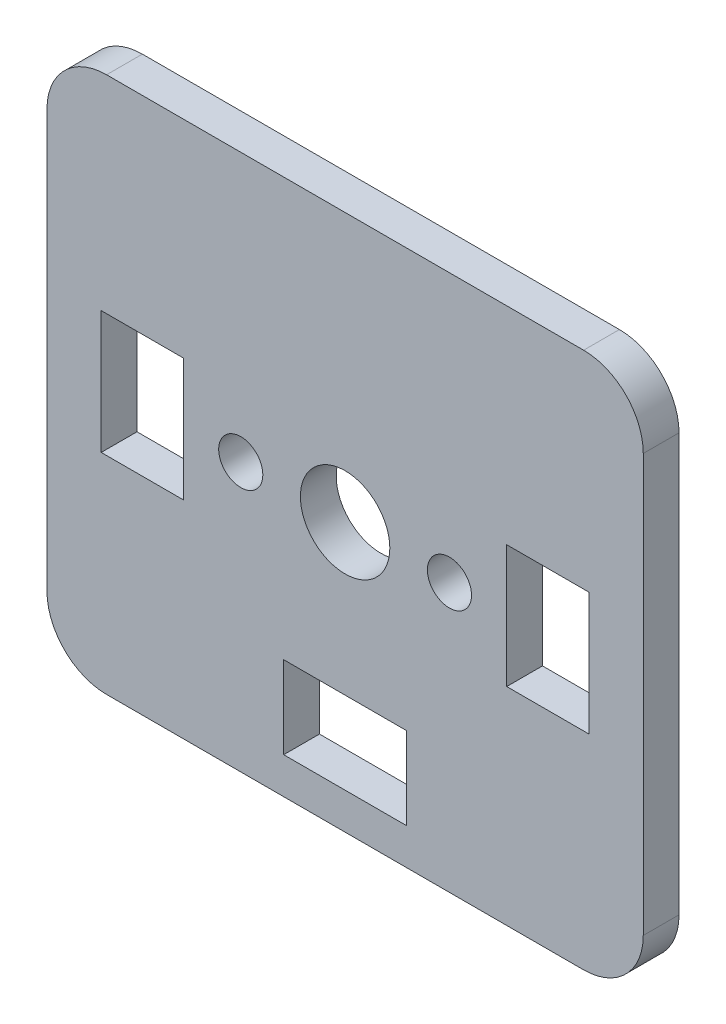
ISO-10303-21;
HEADER;
FILE_DESCRIPTION(('STEP AP214'),'2;1');
FILE_NAME('part.step','',(''),(''),'','','');
FILE_SCHEMA(('AUTOMOTIVE_DESIGN { 1 0 10303 214 1 1 1 1 }'));
ENDSEC;
DATA;
#1=APPLICATION_CONTEXT('core data for automotive mechanical design processes');
#2=APPLICATION_PROTOCOL_DEFINITION('international standard','automotive_design',2000,#1);
#3=PRODUCT_CONTEXT('',#1,'mechanical');
#4=PRODUCT('Part','Part','',(#3));
#5=PRODUCT_RELATED_PRODUCT_CATEGORY('part','',(#4));
#6=PRODUCT_DEFINITION_FORMATION('','',#4);
#7=PRODUCT_DEFINITION_CONTEXT('part definition',#1,'design');
#8=PRODUCT_DEFINITION('design','',#6,#7);
#9=PRODUCT_DEFINITION_SHAPE('','',#8);
#10=(LENGTH_UNIT() NAMED_UNIT(*) SI_UNIT(.MILLI.,.METRE.));
#11=(NAMED_UNIT(*) PLANE_ANGLE_UNIT() SI_UNIT($,.RADIAN.));
#12=(NAMED_UNIT(*) SI_UNIT($,.STERADIAN.) SOLID_ANGLE_UNIT());
#13=UNCERTAINTY_MEASURE_WITH_UNIT(LENGTH_MEASURE(1.E-05),#10,'distance_accuracy_value','');
#14=(GEOMETRIC_REPRESENTATION_CONTEXT(3) GLOBAL_UNCERTAINTY_ASSIGNED_CONTEXT((#13)) GLOBAL_UNIT_ASSIGNED_CONTEXT((#10,
#11,#12)) REPRESENTATION_CONTEXT('',''));
#15=CARTESIAN_POINT('',(0.,0.,0.));
#16=DIRECTION('',(0.,0.,1.));
#17=DIRECTION('',(1.,0.,0.));
#18=AXIS2_PLACEMENT_3D('',#15,#16,#17);
#19=CARTESIAN_POINT('',(0.,0.,3.));
#20=DIRECTION('',(0.,0.,-1.));
#21=DIRECTION('',(-1.,0.,0.));
#22=AXIS2_PLACEMENT_3D('',#19,#20,#21);
#23=PLANE('',#22);
#24=DIRECTION('',(0.,1.,0.));
#25=VECTOR('',#24,1.);
#26=CARTESIAN_POINT('',(20.45,5.15000000000001,3.));
#27=LINE('',#26,#25);
#28=CARTESIAN_POINT('',(20.45,-5.14999999999999,3.));
#29=VERTEX_POINT('',#28);
#30=CARTESIAN_POINT('',(20.45,5.15000000000001,3.));
#31=VERTEX_POINT('',#30);
#32=EDGE_CURVE('E214',#29,#31,#27,.T.);
#33=ORIENTED_EDGE('',*,*,#32,.F.);
#34=DIRECTION('',(1.,0.,0.));
#35=VECTOR('',#34,1.);
#36=CARTESIAN_POINT('',(20.45,-5.14999999999999,3.));
#37=LINE('',#36,#35);
#38=CARTESIAN_POINT('',(13.55,-5.15,3.));
#39=VERTEX_POINT('',#38);
#40=EDGE_CURVE('E222',#39,#29,#37,.T.);
#41=ORIENTED_EDGE('',*,*,#40,.F.);
#42=DIRECTION('',(0.,-1.,0.));
#43=VECTOR('',#42,1.);
#44=CARTESIAN_POINT('',(13.55,5.15,3.));
#45=LINE('',#44,#43);
#46=CARTESIAN_POINT('',(13.55,5.15,3.));
#47=VERTEX_POINT('',#46);
#48=EDGE_CURVE('E219',#47,#39,#45,.T.);
#49=ORIENTED_EDGE('',*,*,#48,.F.);
#50=DIRECTION('',(-1.,0.,0.));
#51=VECTOR('',#50,1.);
#52=CARTESIAN_POINT('',(20.45,5.15000000000001,3.));
#53=LINE('',#52,#51);
#54=EDGE_CURVE('E216',#31,#47,#53,.T.);
#55=ORIENTED_EDGE('',*,*,#54,.F.);
#56=EDGE_LOOP('',(#33,#41,#49,#55));
#57=FACE_BOUND('',#56,.T.);
#58=CARTESIAN_POINT('',(-8.75,0.,3.));
#59=DIRECTION('',(0.,0.,1.));
#60=DIRECTION('',(1.,0.,0.));
#61=AXIS2_PLACEMENT_3D('',#58,#59,#60);
#62=CIRCLE('',#61,1.85);
#63=CARTESIAN_POINT('',(-6.9,0.,3.));
#64=VERTEX_POINT('',#63);
#65=EDGE_CURVE('E276',#64,#64,#62,.T.);
#66=ORIENTED_EDGE('',*,*,#65,.F.);
#67=EDGE_LOOP('',(#66));
#68=FACE_BOUND('',#67,.T.);
#69=CARTESIAN_POINT('',(8.75,0.,3.));
#70=DIRECTION('',(0.,0.,1.));
#71=DIRECTION('',(1.,0.,0.));
#72=AXIS2_PLACEMENT_3D('',#69,#70,#71);
#73=CIRCLE('',#72,1.85);
#74=CARTESIAN_POINT('',(10.6,0.,3.));
#75=VERTEX_POINT('',#74);
#76=EDGE_CURVE('E282',#75,#75,#73,.T.);
#77=ORIENTED_EDGE('',*,*,#76,.F.);
#78=EDGE_LOOP('',(#77));
#79=FACE_BOUND('',#78,.T.);
#80=CARTESIAN_POINT('',(0.,0.,3.));
#81=DIRECTION('',(0.,0.,1.));
#82=DIRECTION('',(1.,0.,0.));
#83=AXIS2_PLACEMENT_3D('',#80,#81,#82);
#84=CIRCLE('',#83,3.75);
#85=CARTESIAN_POINT('',(3.75000000000001,0.,3.));
#86=VERTEX_POINT('',#85);
#87=EDGE_CURVE('E288',#86,#86,#84,.T.);
#88=ORIENTED_EDGE('',*,*,#87,.F.);
#89=EDGE_LOOP('',(#88));
#90=FACE_BOUND('',#89,.T.);
#91=DIRECTION('',(-1.,0.,0.));
#92=VECTOR('',#91,1.);
#93=CARTESIAN_POINT('',(-25.,22.5,3.));
#94=LINE('',#93,#92);
#95=CARTESIAN_POINT('',(20.,22.5,3.));
#96=VERTEX_POINT('',#95);
#97=CARTESIAN_POINT('',(-20.,22.5,3.));
#98=VERTEX_POINT('',#97);
#99=EDGE_CURVE('E297',#96,#98,#94,.T.);
#100=ORIENTED_EDGE('',*,*,#99,.T.);
#101=CARTESIAN_POINT('',(-20.,17.5,3.));
#102=DIRECTION('',(0.,0.,-1.));
#103=DIRECTION('',(-1.,0.,0.));
#104=AXIS2_PLACEMENT_3D('',#101,#102,#103);
#105=CIRCLE('',#104,5.);
#106=CARTESIAN_POINT('',(-25.,17.5,3.));
#107=VERTEX_POINT('',#106);
#108=EDGE_CURVE('E337',#98,#107,#105,.F.);
#109=ORIENTED_EDGE('',*,*,#108,.T.);
#110=DIRECTION('',(0.,-1.,0.));
#111=VECTOR('',#110,1.);
#112=CARTESIAN_POINT('',(-25.,-22.5,3.));
#113=LINE('',#112,#111);
#114=CARTESIAN_POINT('',(-25.,-17.5,3.));
#115=VERTEX_POINT('',#114);
#116=EDGE_CURVE('E301',#107,#115,#113,.T.);
#117=ORIENTED_EDGE('',*,*,#116,.T.);
#118=CARTESIAN_POINT('',(-20.,-17.5,3.));
#119=DIRECTION('',(0.,0.,-1.));
#120=DIRECTION('',(-1.,0.,0.));
#121=AXIS2_PLACEMENT_3D('',#118,#119,#120);
#122=CIRCLE('',#121,5.);
#123=CARTESIAN_POINT('',(-20.,-22.5,3.));
#124=VERTEX_POINT('',#123);
#125=EDGE_CURVE('E55',#115,#124,#122,.F.);
#126=ORIENTED_EDGE('',*,*,#125,.T.);
#127=DIRECTION('',(1.,0.,0.));
#128=VECTOR('',#127,1.);
#129=CARTESIAN_POINT('',(-25.,-22.5,3.));
#130=LINE('',#129,#128);
#131=CARTESIAN_POINT('',(20.,-22.5,3.));
#132=VERTEX_POINT('',#131);
#133=EDGE_CURVE('E303',#124,#132,#130,.T.);
#134=ORIENTED_EDGE('',*,*,#133,.T.);
#135=CARTESIAN_POINT('',(20.,-17.5,3.));
#136=DIRECTION('',(0.,0.,-1.));
#137=DIRECTION('',(-1.,0.,0.));
#138=AXIS2_PLACEMENT_3D('',#135,#136,#137);
#139=CIRCLE('',#138,5.);
#140=CARTESIAN_POINT('',(25.,-17.5,3.));
#141=VERTEX_POINT('',#140);
#142=EDGE_CURVE('E334',#132,#141,#139,.F.);
#143=ORIENTED_EDGE('',*,*,#142,.T.);
#144=DIRECTION('',(0.,1.,0.));
#145=VECTOR('',#144,1.);
#146=CARTESIAN_POINT('',(25.,-22.5,3.));
#147=LINE('',#146,#145);
#148=CARTESIAN_POINT('',(25.,17.5,3.));
#149=VERTEX_POINT('',#148);
#150=EDGE_CURVE('E294',#141,#149,#147,.T.);
#151=ORIENTED_EDGE('',*,*,#150,.T.);
#152=CARTESIAN_POINT('',(20.,17.5,3.));
#153=DIRECTION('',(0.,0.,-1.));
#154=DIRECTION('',(-1.,0.,0.));
#155=AXIS2_PLACEMENT_3D('',#152,#153,#154);
#156=CIRCLE('',#155,5.);
#157=EDGE_CURVE('E332',#149,#96,#156,.F.);
#158=ORIENTED_EDGE('',*,*,#157,.T.);
#159=EDGE_LOOP('',(#100,#109,#117,#126,#134,#143,#151,#158));
#160=FACE_BOUND('',#159,.T.);
#161=DIRECTION('',(0.,1.,0.));
#162=VECTOR('',#161,1.);
#163=CARTESIAN_POINT('',(-13.55,5.15,3.));
#164=LINE('',#163,#162);
#165=CARTESIAN_POINT('',(-13.55,-5.15,3.));
#166=VERTEX_POINT('',#165);
#167=CARTESIAN_POINT('',(-13.55,5.15,3.));
#168=VERTEX_POINT('',#167);
#169=EDGE_CURVE('E245',#166,#168,#164,.T.);
#170=ORIENTED_EDGE('',*,*,#169,.F.);
#171=DIRECTION('',(1.,0.,0.));
#172=VECTOR('',#171,1.);
#173=CARTESIAN_POINT('',(-20.45,-5.15,3.));
#174=LINE('',#173,#172);
#175=CARTESIAN_POINT('',(-20.45,-5.15,3.));
#176=VERTEX_POINT('',#175);
#177=EDGE_CURVE('E253',#176,#166,#174,.T.);
#178=ORIENTED_EDGE('',*,*,#177,.F.);
#179=DIRECTION('',(0.,-1.,0.));
#180=VECTOR('',#179,1.);
#181=CARTESIAN_POINT('',(-20.45,5.15,3.));
#182=LINE('',#181,#180);
#183=CARTESIAN_POINT('',(-20.45,5.15,3.));
#184=VERTEX_POINT('',#183);
#185=EDGE_CURVE('E250',#184,#176,#182,.T.);
#186=ORIENTED_EDGE('',*,*,#185,.F.);
#187=DIRECTION('',(-1.,0.,0.));
#188=VECTOR('',#187,1.);
#189=CARTESIAN_POINT('',(-20.45,5.15,3.));
#190=LINE('',#189,#188);
#191=EDGE_CURVE('E247',#168,#184,#190,.T.);
#192=ORIENTED_EDGE('',*,*,#191,.F.);
#193=EDGE_LOOP('',(#170,#178,#186,#192));
#194=FACE_BOUND('',#193,.T.);
#195=DIRECTION('',(0.,1.,0.));
#196=VECTOR('',#195,1.);
#197=CARTESIAN_POINT('',(5.15,-12.55,3.));
#198=LINE('',#197,#196);
#199=CARTESIAN_POINT('',(5.15,-19.45,3.));
#200=VERTEX_POINT('',#199);
#201=CARTESIAN_POINT('',(5.15,-12.55,3.));
#202=VERTEX_POINT('',#201);
#203=EDGE_CURVE('E173',#200,#202,#198,.T.);
#204=ORIENTED_EDGE('',*,*,#203,.F.);
#205=DIRECTION('',(1.,0.,0.));
#206=VECTOR('',#205,1.);
#207=CARTESIAN_POINT('',(-5.15,-19.45,3.));
#208=LINE('',#207,#206);
#209=CARTESIAN_POINT('',(-5.15,-19.45,3.));
#210=VERTEX_POINT('',#209);
#211=EDGE_CURVE('E198',#210,#200,#208,.T.);
#212=ORIENTED_EDGE('',*,*,#211,.F.);
#213=DIRECTION('',(0.,-1.,0.));
#214=VECTOR('',#213,1.);
#215=CARTESIAN_POINT('',(-5.15,-12.55,3.));
#216=LINE('',#215,#214);
#217=CARTESIAN_POINT('',(-5.15,-12.55,3.));
#218=VERTEX_POINT('',#217);
#219=EDGE_CURVE('E196',#218,#210,#216,.T.);
#220=ORIENTED_EDGE('',*,*,#219,.F.);
#221=DIRECTION('',(-1.,0.,0.));
#222=VECTOR('',#221,1.);
#223=CARTESIAN_POINT('',(-5.15,-12.55,3.));
#224=LINE('',#223,#222);
#225=EDGE_CURVE('E183',#202,#218,#224,.T.);
#226=ORIENTED_EDGE('',*,*,#225,.F.);
#227=EDGE_LOOP('',(#204,#212,#220,#226));
#228=FACE_BOUND('',#227,.T.);
#229=ADVANCED_FACE('F33',(#57,#68,#79,#90,#160,#194,#228),#23,.F.);
#230=CARTESIAN_POINT('',(0.,0.,0.));
#231=DIRECTION('',(0.,0.,-1.));
#232=DIRECTION('',(-1.,0.,0.));
#233=AXIS2_PLACEMENT_3D('',#230,#231,#232);
#234=PLANE('',#233);
#235=CARTESIAN_POINT('',(8.75,0.,0.));
#236=DIRECTION('',(0.,0.,1.));
#237=DIRECTION('',(1.,0.,0.));
#238=AXIS2_PLACEMENT_3D('',#235,#236,#237);
#239=CIRCLE('',#238,1.85);
#240=CARTESIAN_POINT('',(10.6,0.,0.));
#241=VERTEX_POINT('',#240);
#242=EDGE_CURVE('E279',#241,#241,#239,.T.);
#243=ORIENTED_EDGE('',*,*,#242,.T.);
#244=EDGE_LOOP('',(#243));
#245=FACE_BOUND('',#244,.T.);
#246=DIRECTION('',(0.,-1.,0.));
#247=VECTOR('',#246,1.);
#248=CARTESIAN_POINT('',(-25.,-22.5,0.));
#249=LINE('',#248,#247);
#250=CARTESIAN_POINT('',(-25.,17.5,0.));
#251=VERTEX_POINT('',#250);
#252=CARTESIAN_POINT('',(-25.,-17.5,0.));
#253=VERTEX_POINT('',#252);
#254=EDGE_CURVE('E311',#251,#253,#249,.T.);
#255=ORIENTED_EDGE('',*,*,#254,.F.);
#256=CARTESIAN_POINT('',(-20.,17.5,0.));
#257=DIRECTION('',(0.,0.,-1.));
#258=DIRECTION('',(-1.,0.,0.));
#259=AXIS2_PLACEMENT_3D('',#256,#257,#258);
#260=CIRCLE('',#259,5.);
#261=CARTESIAN_POINT('',(-20.,22.5,0.));
#262=VERTEX_POINT('',#261);
#263=EDGE_CURVE('E325',#251,#262,#260,.T.);
#264=ORIENTED_EDGE('',*,*,#263,.T.);
#265=DIRECTION('',(-1.,0.,0.));
#266=VECTOR('',#265,1.);
#267=CARTESIAN_POINT('',(-25.,22.5,0.));
#268=LINE('',#267,#266);
#269=CARTESIAN_POINT('',(20.,22.5,0.));
#270=VERTEX_POINT('',#269);
#271=EDGE_CURVE('E308',#270,#262,#268,.T.);
#272=ORIENTED_EDGE('',*,*,#271,.F.);
#273=CARTESIAN_POINT('',(20.,17.5,0.));
#274=DIRECTION('',(0.,0.,-1.));
#275=DIRECTION('',(-1.,0.,0.));
#276=AXIS2_PLACEMENT_3D('',#273,#274,#275);
#277=CIRCLE('',#276,5.);
#278=CARTESIAN_POINT('',(25.,17.5,0.));
#279=VERTEX_POINT('',#278);
#280=EDGE_CURVE('E319',#270,#279,#277,.T.);
#281=ORIENTED_EDGE('',*,*,#280,.T.);
#282=DIRECTION('',(0.,1.,0.));
#283=VECTOR('',#282,1.);
#284=CARTESIAN_POINT('',(25.,-22.5,0.));
#285=LINE('',#284,#283);
#286=CARTESIAN_POINT('',(25.,-17.5,0.));
#287=VERTEX_POINT('',#286);
#288=EDGE_CURVE('E291',#287,#279,#285,.T.);
#289=ORIENTED_EDGE('',*,*,#288,.F.);
#290=CARTESIAN_POINT('',(20.,-17.5,0.));
#291=DIRECTION('',(0.,0.,-1.));
#292=DIRECTION('',(-1.,0.,0.));
#293=AXIS2_PLACEMENT_3D('',#290,#291,#292);
#294=CIRCLE('',#293,5.);
#295=CARTESIAN_POINT('',(20.,-22.5,0.));
#296=VERTEX_POINT('',#295);
#297=EDGE_CURVE('E321',#287,#296,#294,.T.);
#298=ORIENTED_EDGE('',*,*,#297,.T.);
#299=DIRECTION('',(1.,0.,0.));
#300=VECTOR('',#299,1.);
#301=CARTESIAN_POINT('',(-25.,-22.5,0.));
#302=LINE('',#301,#300);
#303=CARTESIAN_POINT('',(-20.,-22.5,0.));
#304=VERTEX_POINT('',#303);
#305=EDGE_CURVE('E298',#304,#296,#302,.T.);
#306=ORIENTED_EDGE('',*,*,#305,.F.);
#307=CARTESIAN_POINT('',(-20.,-17.5,0.));
#308=DIRECTION('',(0.,0.,-1.));
#309=DIRECTION('',(-1.,0.,0.));
#310=AXIS2_PLACEMENT_3D('',#307,#308,#309);
#311=CIRCLE('',#310,5.);
#312=EDGE_CURVE('E323',#304,#253,#311,.T.);
#313=ORIENTED_EDGE('',*,*,#312,.T.);
#314=EDGE_LOOP('',(#255,#264,#272,#281,#289,#298,#306,#313));
#315=FACE_BOUND('',#314,.T.);
#316=CARTESIAN_POINT('',(0.,0.,0.));
#317=DIRECTION('',(0.,0.,1.));
#318=DIRECTION('',(1.,0.,0.));
#319=AXIS2_PLACEMENT_3D('',#316,#317,#318);
#320=CIRCLE('',#319,3.75);
#321=CARTESIAN_POINT('',(3.75000000000001,0.,0.));
#322=VERTEX_POINT('',#321);
#323=EDGE_CURVE('E285',#322,#322,#320,.T.);
#324=ORIENTED_EDGE('',*,*,#323,.T.);
#325=EDGE_LOOP('',(#324));
#326=FACE_BOUND('',#325,.T.);
#327=CARTESIAN_POINT('',(-8.75,0.,0.));
#328=DIRECTION('',(0.,0.,1.));
#329=DIRECTION('',(1.,0.,0.));
#330=AXIS2_PLACEMENT_3D('',#327,#328,#329);
#331=CIRCLE('',#330,1.85);
#332=CARTESIAN_POINT('',(-6.9,0.,0.));
#333=VERTEX_POINT('',#332);
#334=EDGE_CURVE('E275',#333,#333,#331,.T.);
#335=ORIENTED_EDGE('',*,*,#334,.T.);
#336=EDGE_LOOP('',(#335));
#337=FACE_BOUND('',#336,.T.);
#338=DIRECTION('',(1.,0.,0.));
#339=VECTOR('',#338,1.);
#340=CARTESIAN_POINT('',(-20.45,-5.15,0.));
#341=LINE('',#340,#339);
#342=CARTESIAN_POINT('',(-20.45,-5.15,0.));
#343=VERTEX_POINT('',#342);
#344=CARTESIAN_POINT('',(-13.55,-5.15,0.));
#345=VERTEX_POINT('',#344);
#346=EDGE_CURVE('E248',#343,#345,#341,.T.);
#347=ORIENTED_EDGE('',*,*,#346,.T.);
#348=DIRECTION('',(0.,1.,0.));
#349=VECTOR('',#348,1.);
#350=CARTESIAN_POINT('',(-13.55,5.15,0.));
#351=LINE('',#350,#349);
#352=CARTESIAN_POINT('',(-13.55,5.15,0.));
#353=VERTEX_POINT('',#352);
#354=EDGE_CURVE('E244',#345,#353,#351,.T.);
#355=ORIENTED_EDGE('',*,*,#354,.T.);
#356=DIRECTION('',(-1.,0.,0.));
#357=VECTOR('',#356,1.);
#358=CARTESIAN_POINT('',(-20.45,5.15,0.));
#359=LINE('',#358,#357);
#360=CARTESIAN_POINT('',(-20.45,5.15,0.));
#361=VERTEX_POINT('',#360);
#362=EDGE_CURVE('E258',#353,#361,#359,.T.);
#363=ORIENTED_EDGE('',*,*,#362,.T.);
#364=DIRECTION('',(0.,-1.,0.));
#365=VECTOR('',#364,1.);
#366=CARTESIAN_POINT('',(-20.45,5.15,0.));
#367=LINE('',#366,#365);
#368=EDGE_CURVE('E261',#361,#343,#367,.T.);
#369=ORIENTED_EDGE('',*,*,#368,.T.);
#370=EDGE_LOOP('',(#347,#355,#363,#369));
#371=FACE_BOUND('',#370,.T.);
#372=DIRECTION('',(1.,0.,0.));
#373=VECTOR('',#372,1.);
#374=CARTESIAN_POINT('',(20.45,-5.14999999999999,0.));
#375=LINE('',#374,#373);
#376=CARTESIAN_POINT('',(13.55,-5.15,0.));
#377=VERTEX_POINT('',#376);
#378=CARTESIAN_POINT('',(20.45,-5.14999999999999,0.));
#379=VERTEX_POINT('',#378);
#380=EDGE_CURVE('E217',#377,#379,#375,.T.);
#381=ORIENTED_EDGE('',*,*,#380,.T.);
#382=DIRECTION('',(0.,1.,0.));
#383=VECTOR('',#382,1.);
#384=CARTESIAN_POINT('',(20.45,5.15000000000001,0.));
#385=LINE('',#384,#383);
#386=CARTESIAN_POINT('',(20.45,5.15000000000001,0.));
#387=VERTEX_POINT('',#386);
#388=EDGE_CURVE('E191',#379,#387,#385,.T.);
#389=ORIENTED_EDGE('',*,*,#388,.T.);
#390=DIRECTION('',(-1.,0.,0.));
#391=VECTOR('',#390,1.);
#392=CARTESIAN_POINT('',(20.45,5.15000000000001,0.));
#393=LINE('',#392,#391);
#394=CARTESIAN_POINT('',(13.55,5.15,0.));
#395=VERTEX_POINT('',#394);
#396=EDGE_CURVE('E227',#387,#395,#393,.T.);
#397=ORIENTED_EDGE('',*,*,#396,.T.);
#398=DIRECTION('',(0.,-1.,0.));
#399=VECTOR('',#398,1.);
#400=CARTESIAN_POINT('',(13.55,5.15,0.));
#401=LINE('',#400,#399);
#402=EDGE_CURVE('E230',#395,#377,#401,.T.);
#403=ORIENTED_EDGE('',*,*,#402,.T.);
#404=EDGE_LOOP('',(#381,#389,#397,#403));
#405=FACE_BOUND('',#404,.T.);
#406=DIRECTION('',(1.,0.,0.));
#407=VECTOR('',#406,1.);
#408=CARTESIAN_POINT('',(-5.15,-19.45,0.));
#409=LINE('',#408,#407);
#410=CARTESIAN_POINT('',(-5.15,-19.45,0.));
#411=VERTEX_POINT('',#410);
#412=CARTESIAN_POINT('',(5.15,-19.45,0.));
#413=VERTEX_POINT('',#412);
#414=EDGE_CURVE('E184',#411,#413,#409,.T.);
#415=ORIENTED_EDGE('',*,*,#414,.T.);
#416=DIRECTION('',(0.,1.,0.));
#417=VECTOR('',#416,1.);
#418=CARTESIAN_POINT('',(5.15,-12.55,0.));
#419=LINE('',#418,#417);
#420=CARTESIAN_POINT('',(5.15,-12.55,0.));
#421=VERTEX_POINT('',#420);
#422=EDGE_CURVE('E202',#413,#421,#419,.T.);
#423=ORIENTED_EDGE('',*,*,#422,.T.);
#424=DIRECTION('',(-1.,0.,0.));
#425=VECTOR('',#424,1.);
#426=CARTESIAN_POINT('',(-5.15,-12.55,0.));
#427=LINE('',#426,#425);
#428=CARTESIAN_POINT('',(-5.15,-12.55,0.));
#429=VERTEX_POINT('',#428);
#430=EDGE_CURVE('E190',#421,#429,#427,.T.);
#431=ORIENTED_EDGE('',*,*,#430,.T.);
#432=DIRECTION('',(0.,-1.,0.));
#433=VECTOR('',#432,1.);
#434=CARTESIAN_POINT('',(-5.15,-12.55,0.));
#435=LINE('',#434,#433);
#436=EDGE_CURVE('E205',#429,#411,#435,.T.);
#437=ORIENTED_EDGE('',*,*,#436,.T.);
#438=EDGE_LOOP('',(#415,#423,#431,#437));
#439=FACE_BOUND('',#438,.T.);
#440=ADVANCED_FACE('F360',(#245,#315,#326,#337,#371,#405,#439),#234,.T.);
#441=CARTESIAN_POINT('',(25.,-22.5,3.));
#442=DIRECTION('',(-1.,0.,0.));
#443=DIRECTION('',(0.,0.,1.));
#444=AXIS2_PLACEMENT_3D('',#441,#442,#443);
#445=PLANE('',#444);
#446=ORIENTED_EDGE('',*,*,#150,.F.);
#447=DIRECTION('',(0.,0.,-1.));
#448=VECTOR('',#447,1.);
#449=CARTESIAN_POINT('',(25.,-17.5,3.));
#450=LINE('',#449,#448);
#451=EDGE_CURVE('E11',#141,#287,#450,.T.);
#452=ORIENTED_EDGE('',*,*,#451,.T.);
#453=ORIENTED_EDGE('',*,*,#288,.T.);
#454=DIRECTION('',(0.,0.,-1.));
#455=VECTOR('',#454,1.);
#456=CARTESIAN_POINT('',(25.,17.5,3.));
#457=LINE('',#456,#455);
#458=EDGE_CURVE('E41',#279,#149,#457,.F.);
#459=ORIENTED_EDGE('',*,*,#458,.T.);
#460=EDGE_LOOP('',(#446,#452,#453,#459));
#461=FACE_BOUND('',#460,.T.);
#462=ADVANCED_FACE('F345',(#461),#445,.F.);
#463=CARTESIAN_POINT('',(-25.,22.5,3.));
#464=DIRECTION('',(0.,-1.,0.));
#465=DIRECTION('',(0.,0.,-1.));
#466=AXIS2_PLACEMENT_3D('',#463,#464,#465);
#467=PLANE('',#466);
#468=ORIENTED_EDGE('',*,*,#271,.T.);
#469=DIRECTION('',(0.,0.,-1.));
#470=VECTOR('',#469,1.);
#471=CARTESIAN_POINT('',(-20.,22.5,3.));
#472=LINE('',#471,#470);
#473=EDGE_CURVE('E330',#262,#98,#472,.F.);
#474=ORIENTED_EDGE('',*,*,#473,.T.);
#475=ORIENTED_EDGE('',*,*,#99,.F.);
#476=DIRECTION('',(0.,0.,-1.));
#477=VECTOR('',#476,1.);
#478=CARTESIAN_POINT('',(20.,22.5,3.));
#479=LINE('',#478,#477);
#480=EDGE_CURVE('E327',#96,#270,#479,.T.);
#481=ORIENTED_EDGE('',*,*,#480,.T.);
#482=EDGE_LOOP('',(#468,#474,#475,#481));
#483=FACE_BOUND('',#482,.T.);
#484=ADVANCED_FACE('F356',(#483),#467,.F.);
#485=CARTESIAN_POINT('',(-25.,-22.5,3.));
#486=DIRECTION('',(1.,0.,0.));
#487=DIRECTION('',(0.,0.,-1.));
#488=AXIS2_PLACEMENT_3D('',#485,#486,#487);
#489=PLANE('',#488);
#490=ORIENTED_EDGE('',*,*,#116,.F.);
#491=DIRECTION('',(0.,0.,-1.));
#492=VECTOR('',#491,1.);
#493=CARTESIAN_POINT('',(-25.,17.5,3.));
#494=LINE('',#493,#492);
#495=EDGE_CURVE('E316',#107,#251,#494,.T.);
#496=ORIENTED_EDGE('',*,*,#495,.T.);
#497=ORIENTED_EDGE('',*,*,#254,.T.);
#498=DIRECTION('',(0.,0.,-1.));
#499=VECTOR('',#498,1.);
#500=CARTESIAN_POINT('',(-25.,-17.5,3.));
#501=LINE('',#500,#499);
#502=EDGE_CURVE('E305',#253,#115,#501,.F.);
#503=ORIENTED_EDGE('',*,*,#502,.T.);
#504=EDGE_LOOP('',(#490,#496,#497,#503));
#505=FACE_BOUND('',#504,.T.);
#506=ADVANCED_FACE('F368',(#505),#489,.F.);
#507=CARTESIAN_POINT('',(-25.,-22.5,3.));
#508=DIRECTION('',(0.,1.,0.));
#509=DIRECTION('',(0.,0.,1.));
#510=AXIS2_PLACEMENT_3D('',#507,#508,#509);
#511=PLANE('',#510);
#512=ORIENTED_EDGE('',*,*,#133,.F.);
#513=DIRECTION('',(0.,0.,-1.));
#514=VECTOR('',#513,1.);
#515=CARTESIAN_POINT('',(-20.,-22.5,3.));
#516=LINE('',#515,#514);
#517=EDGE_CURVE('E340',#124,#304,#516,.T.);
#518=ORIENTED_EDGE('',*,*,#517,.T.);
#519=ORIENTED_EDGE('',*,*,#305,.T.);
#520=DIRECTION('',(0.,0.,-1.));
#521=VECTOR('',#520,1.);
#522=CARTESIAN_POINT('',(20.,-22.5,3.));
#523=LINE('',#522,#521);
#524=EDGE_CURVE('E48',#296,#132,#523,.F.);
#525=ORIENTED_EDGE('',*,*,#524,.T.);
#526=EDGE_LOOP('',(#512,#518,#519,#525));
#527=FACE_BOUND('',#526,.T.);
#528=ADVANCED_FACE('F374',(#527),#511,.F.);
#529=CARTESIAN_POINT('',(0.,0.,3.));
#530=DIRECTION('',(0.,0.,-1.));
#531=DIRECTION('',(-1.,0.,0.));
#532=AXIS2_PLACEMENT_3D('',#529,#530,#531);
#533=CYLINDRICAL_SURFACE('',#532,3.75);
#534=ORIENTED_EDGE('',*,*,#87,.T.);
#535=EDGE_LOOP('',(#534));
#536=FACE_BOUND('',#535,.T.);
#537=ORIENTED_EDGE('',*,*,#323,.F.);
#538=EDGE_LOOP('',(#537));
#539=FACE_BOUND('',#538,.T.);
#540=ADVANCED_FACE('F394',(#536,#539),#533,.F.);
#541=CARTESIAN_POINT('',(8.75,0.,3.));
#542=DIRECTION('',(0.,0.,-1.));
#543=DIRECTION('',(-1.,0.,0.));
#544=AXIS2_PLACEMENT_3D('',#541,#542,#543);
#545=CYLINDRICAL_SURFACE('',#544,1.85);
#546=ORIENTED_EDGE('',*,*,#76,.T.);
#547=EDGE_LOOP('',(#546));
#548=FACE_BOUND('',#547,.T.);
#549=ORIENTED_EDGE('',*,*,#242,.F.);
#550=EDGE_LOOP('',(#549));
#551=FACE_BOUND('',#550,.T.);
#552=ADVANCED_FACE('F458',(#548,#551),#545,.F.);
#553=CARTESIAN_POINT('',(-8.75,0.,3.));
#554=DIRECTION('',(0.,0.,-1.));
#555=DIRECTION('',(-1.,0.,0.));
#556=AXIS2_PLACEMENT_3D('',#553,#554,#555);
#557=CYLINDRICAL_SURFACE('',#556,1.85);
#558=ORIENTED_EDGE('',*,*,#65,.T.);
#559=EDGE_LOOP('',(#558));
#560=FACE_BOUND('',#559,.T.);
#561=ORIENTED_EDGE('',*,*,#334,.F.);
#562=EDGE_LOOP('',(#561));
#563=FACE_BOUND('',#562,.T.);
#564=ADVANCED_FACE('F455',(#560,#563),#557,.F.);
#565=CARTESIAN_POINT('',(-13.55,5.15,3.));
#566=DIRECTION('',(-1.,0.,0.));
#567=DIRECTION('',(0.,0.,1.));
#568=AXIS2_PLACEMENT_3D('',#565,#566,#567);
#569=PLANE('',#568);
#570=ORIENTED_EDGE('',*,*,#354,.F.);
#571=DIRECTION('',(0.,0.,-1.));
#572=VECTOR('',#571,1.);
#573=CARTESIAN_POINT('',(-13.55,-5.15,3.));
#574=LINE('',#573,#572);
#575=EDGE_CURVE('E255',#166,#345,#574,.T.);
#576=ORIENTED_EDGE('',*,*,#575,.F.);
#577=ORIENTED_EDGE('',*,*,#169,.T.);
#578=DIRECTION('',(0.,0.,-1.));
#579=VECTOR('',#578,1.);
#580=CARTESIAN_POINT('',(-13.55,5.15,3.));
#581=LINE('',#580,#579);
#582=EDGE_CURVE('E272',#168,#353,#581,.T.);
#583=ORIENTED_EDGE('',*,*,#582,.T.);
#584=EDGE_LOOP('',(#570,#576,#577,#583));
#585=FACE_BOUND('',#584,.T.);
#586=ADVANCED_FACE('F451',(#585),#569,.T.);
#587=CARTESIAN_POINT('',(-20.45,5.15,3.));
#588=DIRECTION('',(0.,-1.,0.));
#589=DIRECTION('',(0.,0.,-1.));
#590=AXIS2_PLACEMENT_3D('',#587,#588,#589);
#591=PLANE('',#590);
#592=ORIENTED_EDGE('',*,*,#362,.F.);
#593=ORIENTED_EDGE('',*,*,#582,.F.);
#594=ORIENTED_EDGE('',*,*,#191,.T.);
#595=DIRECTION('',(0.,0.,-1.));
#596=VECTOR('',#595,1.);
#597=CARTESIAN_POINT('',(-20.45,5.15,3.));
#598=LINE('',#597,#596);
#599=EDGE_CURVE('E270',#184,#361,#598,.T.);
#600=ORIENTED_EDGE('',*,*,#599,.T.);
#601=EDGE_LOOP('',(#592,#593,#594,#600));
#602=FACE_BOUND('',#601,.T.);
#603=ADVANCED_FACE('F447',(#602),#591,.T.);
#604=CARTESIAN_POINT('',(-20.45,5.15,3.));
#605=DIRECTION('',(1.,0.,0.));
#606=DIRECTION('',(0.,0.,-1.));
#607=AXIS2_PLACEMENT_3D('',#604,#605,#606);
#608=PLANE('',#607);
#609=ORIENTED_EDGE('',*,*,#368,.F.);
#610=ORIENTED_EDGE('',*,*,#599,.F.);
#611=ORIENTED_EDGE('',*,*,#185,.T.);
#612=DIRECTION('',(0.,0.,-1.));
#613=VECTOR('',#612,1.);
#614=CARTESIAN_POINT('',(-20.45,-5.15,3.));
#615=LINE('',#614,#613);
#616=EDGE_CURVE('E268',#176,#343,#615,.T.);
#617=ORIENTED_EDGE('',*,*,#616,.T.);
#618=EDGE_LOOP('',(#609,#610,#611,#617));
#619=FACE_BOUND('',#618,.T.);
#620=ADVANCED_FACE('F443',(#619),#608,.T.);
#621=CARTESIAN_POINT('',(-20.45,-5.15,3.));
#622=DIRECTION('',(0.,1.,0.));
#623=DIRECTION('',(0.,0.,1.));
#624=AXIS2_PLACEMENT_3D('',#621,#622,#623);
#625=PLANE('',#624);
#626=ORIENTED_EDGE('',*,*,#346,.F.);
#627=ORIENTED_EDGE('',*,*,#616,.F.);
#628=ORIENTED_EDGE('',*,*,#177,.T.);
#629=ORIENTED_EDGE('',*,*,#575,.T.);
#630=EDGE_LOOP('',(#626,#627,#628,#629));
#631=FACE_BOUND('',#630,.T.);
#632=ADVANCED_FACE('F439',(#631),#625,.T.);
#633=CARTESIAN_POINT('',(20.45,5.15000000000001,3.));
#634=DIRECTION('',(-1.,0.,0.));
#635=DIRECTION('',(0.,-1.,0.));
#636=AXIS2_PLACEMENT_3D('',#633,#634,#635);
#637=PLANE('',#636);
#638=ORIENTED_EDGE('',*,*,#388,.F.);
#639=DIRECTION('',(0.,0.,-1.));
#640=VECTOR('',#639,1.);
#641=CARTESIAN_POINT('',(20.45,-5.14999999999999,3.));
#642=LINE('',#641,#640);
#643=EDGE_CURVE('E224',#29,#379,#642,.T.);
#644=ORIENTED_EDGE('',*,*,#643,.F.);
#645=ORIENTED_EDGE('',*,*,#32,.T.);
#646=DIRECTION('',(0.,0.,-1.));
#647=VECTOR('',#646,1.);
#648=CARTESIAN_POINT('',(20.45,5.15000000000001,3.));
#649=LINE('',#648,#647);
#650=EDGE_CURVE('E241',#31,#387,#649,.T.);
#651=ORIENTED_EDGE('',*,*,#650,.T.);
#652=EDGE_LOOP('',(#638,#644,#645,#651));
#653=FACE_BOUND('',#652,.T.);
#654=ADVANCED_FACE('F435',(#653),#637,.T.);
#655=CARTESIAN_POINT('',(20.45,5.15000000000001,3.));
#656=DIRECTION('',(0.,-1.,0.));
#657=DIRECTION('',(1.,0.,0.));
#658=AXIS2_PLACEMENT_3D('',#655,#656,#657);
#659=PLANE('',#658);
#660=ORIENTED_EDGE('',*,*,#396,.F.);
#661=ORIENTED_EDGE('',*,*,#650,.F.);
#662=ORIENTED_EDGE('',*,*,#54,.T.);
#663=DIRECTION('',(0.,0.,-1.));
#664=VECTOR('',#663,1.);
#665=CARTESIAN_POINT('',(13.55,5.15,3.));
#666=LINE('',#665,#664);
#667=EDGE_CURVE('E239',#47,#395,#666,.T.);
#668=ORIENTED_EDGE('',*,*,#667,.T.);
#669=EDGE_LOOP('',(#660,#661,#662,#668));
#670=FACE_BOUND('',#669,.T.);
#671=ADVANCED_FACE('F431',(#670),#659,.T.);
#672=CARTESIAN_POINT('',(13.55,5.15,3.));
#673=DIRECTION('',(1.,0.,0.));
#674=DIRECTION('',(0.,1.,0.));
#675=AXIS2_PLACEMENT_3D('',#672,#673,#674);
#676=PLANE('',#675);
#677=ORIENTED_EDGE('',*,*,#402,.F.);
#678=ORIENTED_EDGE('',*,*,#667,.F.);
#679=ORIENTED_EDGE('',*,*,#48,.T.);
#680=DIRECTION('',(0.,0.,-1.));
#681=VECTOR('',#680,1.);
#682=CARTESIAN_POINT('',(13.55,-5.15,3.));
#683=LINE('',#682,#681);
#684=EDGE_CURVE('E237',#39,#377,#683,.T.);
#685=ORIENTED_EDGE('',*,*,#684,.T.);
#686=EDGE_LOOP('',(#677,#678,#679,#685));
#687=FACE_BOUND('',#686,.T.);
#688=ADVANCED_FACE('F427',(#687),#676,.T.);
#689=CARTESIAN_POINT('',(20.45,-5.14999999999999,3.));
#690=DIRECTION('',(0.,1.,0.));
#691=DIRECTION('',(-1.,0.,0.));
#692=AXIS2_PLACEMENT_3D('',#689,#690,#691);
#693=PLANE('',#692);
#694=ORIENTED_EDGE('',*,*,#380,.F.);
#695=ORIENTED_EDGE('',*,*,#684,.F.);
#696=ORIENTED_EDGE('',*,*,#40,.T.);
#697=ORIENTED_EDGE('',*,*,#643,.T.);
#698=EDGE_LOOP('',(#694,#695,#696,#697));
#699=FACE_BOUND('',#698,.T.);
#700=ADVANCED_FACE('F424',(#699),#693,.T.);
#701=CARTESIAN_POINT('',(5.15,-12.55,3.));
#702=DIRECTION('',(-1.,0.,0.));
#703=DIRECTION('',(0.,-1.,0.));
#704=AXIS2_PLACEMENT_3D('',#701,#702,#703);
#705=PLANE('',#704);
#706=ORIENTED_EDGE('',*,*,#422,.F.);
#707=DIRECTION('',(0.,0.,-1.));
#708=VECTOR('',#707,1.);
#709=CARTESIAN_POINT('',(5.15,-19.45,3.));
#710=LINE('',#709,#708);
#711=EDGE_CURVE('E179',#200,#413,#710,.T.);
#712=ORIENTED_EDGE('',*,*,#711,.F.);
#713=ORIENTED_EDGE('',*,*,#203,.T.);
#714=DIRECTION('',(0.,0.,-1.));
#715=VECTOR('',#714,1.);
#716=CARTESIAN_POINT('',(5.15,-12.55,3.));
#717=LINE('',#716,#715);
#718=EDGE_CURVE('E176',#202,#421,#717,.T.);
#719=ORIENTED_EDGE('',*,*,#718,.T.);
#720=EDGE_LOOP('',(#706,#712,#713,#719));
#721=FACE_BOUND('',#720,.T.);
#722=ADVANCED_FACE('F175',(#721),#705,.T.);
#723=CARTESIAN_POINT('',(-5.15,-12.55,3.));
#724=DIRECTION('',(0.,-1.,0.));
#725=DIRECTION('',(0.,0.,-1.));
#726=AXIS2_PLACEMENT_3D('',#723,#724,#725);
#727=PLANE('',#726);
#728=ORIENTED_EDGE('',*,*,#430,.F.);
#729=ORIENTED_EDGE('',*,*,#718,.F.);
#730=ORIENTED_EDGE('',*,*,#225,.T.);
#731=DIRECTION('',(0.,0.,-1.));
#732=VECTOR('',#731,1.);
#733=CARTESIAN_POINT('',(-5.15,-12.55,3.));
#734=LINE('',#733,#732);
#735=EDGE_CURVE('E192',#218,#429,#734,.T.);
#736=ORIENTED_EDGE('',*,*,#735,.T.);
#737=EDGE_LOOP('',(#728,#729,#730,#736));
#738=FACE_BOUND('',#737,.T.);
#739=ADVANCED_FACE('F187',(#738),#727,.T.);
#740=CARTESIAN_POINT('',(-5.15,-12.55,3.));
#741=DIRECTION('',(1.,0.,0.));
#742=DIRECTION('',(0.,1.,0.));
#743=AXIS2_PLACEMENT_3D('',#740,#741,#742);
#744=PLANE('',#743);
#745=ORIENTED_EDGE('',*,*,#436,.F.);
#746=ORIENTED_EDGE('',*,*,#735,.F.);
#747=ORIENTED_EDGE('',*,*,#219,.T.);
#748=DIRECTION('',(0.,0.,-1.));
#749=VECTOR('',#748,1.);
#750=CARTESIAN_POINT('',(-5.15,-19.45,3.));
#751=LINE('',#750,#749);
#752=EDGE_CURVE('E211',#210,#411,#751,.T.);
#753=ORIENTED_EDGE('',*,*,#752,.T.);
#754=EDGE_LOOP('',(#745,#746,#747,#753));
#755=FACE_BOUND('',#754,.T.);
#756=ADVANCED_FACE('F410',(#755),#744,.T.);
#757=CARTESIAN_POINT('',(-5.15,-19.45,3.));
#758=DIRECTION('',(0.,1.,0.));
#759=DIRECTION('',(0.,0.,1.));
#760=AXIS2_PLACEMENT_3D('',#757,#758,#759);
#761=PLANE('',#760);
#762=ORIENTED_EDGE('',*,*,#414,.F.);
#763=ORIENTED_EDGE('',*,*,#752,.F.);
#764=ORIENTED_EDGE('',*,*,#211,.T.);
#765=ORIENTED_EDGE('',*,*,#711,.T.);
#766=EDGE_LOOP('',(#762,#763,#764,#765));
#767=FACE_BOUND('',#766,.T.);
#768=ADVANCED_FACE('F406',(#767),#761,.T.);
#769=CARTESIAN_POINT('',(-20.,17.5,3.));
#770=DIRECTION('',(0.,0.,-1.));
#771=DIRECTION('',(-1.,0.,0.));
#772=AXIS2_PLACEMENT_3D('',#769,#770,#771);
#773=CYLINDRICAL_SURFACE('',#772,5.);
#774=ORIENTED_EDGE('',*,*,#108,.F.);
#775=ORIENTED_EDGE('',*,*,#473,.F.);
#776=ORIENTED_EDGE('',*,*,#263,.F.);
#777=ORIENTED_EDGE('',*,*,#495,.F.);
#778=EDGE_LOOP('',(#774,#775,#776,#777));
#779=FACE_BOUND('',#778,.T.);
#780=ADVANCED_FACE('F365',(#779),#773,.T.);
#781=CARTESIAN_POINT('',(-20.,-17.5,3.));
#782=DIRECTION('',(0.,0.,-1.));
#783=DIRECTION('',(-1.,0.,0.));
#784=AXIS2_PLACEMENT_3D('',#781,#782,#783);
#785=CYLINDRICAL_SURFACE('',#784,5.);
#786=ORIENTED_EDGE('',*,*,#125,.F.);
#787=ORIENTED_EDGE('',*,*,#502,.F.);
#788=ORIENTED_EDGE('',*,*,#312,.F.);
#789=ORIENTED_EDGE('',*,*,#517,.F.);
#790=EDGE_LOOP('',(#786,#787,#788,#789));
#791=FACE_BOUND('',#790,.T.);
#792=ADVANCED_FACE('F372',(#791),#785,.T.);
#793=CARTESIAN_POINT('',(20.,-17.5,3.));
#794=DIRECTION('',(0.,0.,-1.));
#795=DIRECTION('',(-1.,0.,0.));
#796=AXIS2_PLACEMENT_3D('',#793,#794,#795);
#797=CYLINDRICAL_SURFACE('',#796,5.);
#798=ORIENTED_EDGE('',*,*,#142,.F.);
#799=ORIENTED_EDGE('',*,*,#524,.F.);
#800=ORIENTED_EDGE('',*,*,#297,.F.);
#801=ORIENTED_EDGE('',*,*,#451,.F.);
#802=EDGE_LOOP('',(#798,#799,#800,#801));
#803=FACE_BOUND('',#802,.T.);
#804=ADVANCED_FACE('F376',(#803),#797,.T.);
#805=CARTESIAN_POINT('',(20.,17.5,3.));
#806=DIRECTION('',(0.,0.,-1.));
#807=DIRECTION('',(-1.,0.,0.));
#808=AXIS2_PLACEMENT_3D('',#805,#806,#807);
#809=CYLINDRICAL_SURFACE('',#808,5.);
#810=ORIENTED_EDGE('',*,*,#157,.F.);
#811=ORIENTED_EDGE('',*,*,#458,.F.);
#812=ORIENTED_EDGE('',*,*,#280,.F.);
#813=ORIENTED_EDGE('',*,*,#480,.F.);
#814=EDGE_LOOP('',(#810,#811,#812,#813));
#815=FACE_BOUND('',#814,.T.);
#816=ADVANCED_FACE('F35',(#815),#809,.T.);
#817=CLOSED_SHELL('',(#229,#440,#462,#484,#506,#528,#540,#552,#564,#586,#603,#620,#632,#654,
#671,#688,#700,#722,#739,#756,#768,#780,#792,#804,#816));
#818=MANIFOLD_SOLID_BREP('B2',#817);
#819=ADVANCED_BREP_SHAPE_REPRESENTATION('',(#18,#818),#14);
#820=SHAPE_DEFINITION_REPRESENTATION(#9,#819);
ENDSEC;
END-ISO-10303-21;
